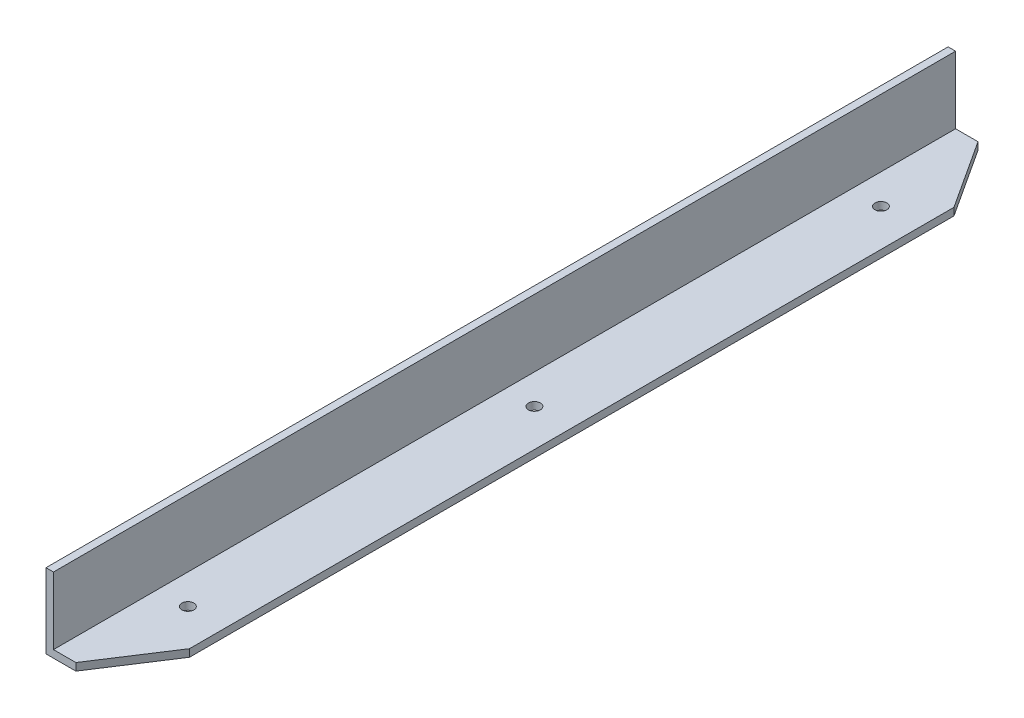
ISO-10303-21;
HEADER;
FILE_DESCRIPTION(('STEP AP214'),'2;1');
FILE_NAME('part.step','',(''),(''),'','','');
FILE_SCHEMA(('AUTOMOTIVE_DESIGN { 1 0 10303 214 1 1 1 1 }'));
ENDSEC;
DATA;
#1=APPLICATION_CONTEXT('core data for automotive mechanical design processes');
#2=APPLICATION_PROTOCOL_DEFINITION('international standard','automotive_design',2000,#1);
#3=PRODUCT_CONTEXT('',#1,'mechanical');
#4=PRODUCT('Part','Part','',(#3));
#5=PRODUCT_RELATED_PRODUCT_CATEGORY('part','',(#4));
#6=PRODUCT_DEFINITION_FORMATION('','',#4);
#7=PRODUCT_DEFINITION_CONTEXT('part definition',#1,'design');
#8=PRODUCT_DEFINITION('design','',#6,#7);
#9=PRODUCT_DEFINITION_SHAPE('','',#8);
#10=(LENGTH_UNIT() NAMED_UNIT(*) SI_UNIT(.MILLI.,.METRE.));
#11=(NAMED_UNIT(*) PLANE_ANGLE_UNIT() SI_UNIT($,.RADIAN.));
#12=(NAMED_UNIT(*) SI_UNIT($,.STERADIAN.) SOLID_ANGLE_UNIT());
#13=UNCERTAINTY_MEASURE_WITH_UNIT(LENGTH_MEASURE(1.E-05),#10,'distance_accuracy_value','');
#14=(GEOMETRIC_REPRESENTATION_CONTEXT(3) GLOBAL_UNCERTAINTY_ASSIGNED_CONTEXT((#13)) GLOBAL_UNIT_ASSIGNED_CONTEXT((#10,
#11,#12)) REPRESENTATION_CONTEXT('',''));
#15=CARTESIAN_POINT('',(0.,0.,0.));
#16=DIRECTION('',(0.,0.,1.));
#17=DIRECTION('',(1.,0.,0.));
#18=AXIS2_PLACEMENT_3D('',#15,#16,#17);
#19=CARTESIAN_POINT('',(8.27485380116921,-30.4619883040935,232.01));
#20=DIRECTION('',(0.,1.,0.));
#21=DIRECTION('',(0.,0.,1.));
#22=AXIS2_PLACEMENT_3D('',#19,#20,#21);
#23=CYLINDRICAL_SURFACE('',#22,4.);
#24=CARTESIAN_POINT('',(8.27485380116944,-10.4619883040936,232.01));
#25=DIRECTION('',(0.,1.,0.));
#26=DIRECTION('',(0.,0.,1.));
#27=AXIS2_PLACEMENT_3D('',#24,#25,#26);
#28=CIRCLE('',#27,4.);
#29=CARTESIAN_POINT('',(8.27485380116944,-10.4619883040936,236.01));
#30=VERTEX_POINT('',#29);
#31=EDGE_CURVE('E48',#30,#30,#28,.T.);
#32=ORIENTED_EDGE('',*,*,#31,.T.);
#33=EDGE_LOOP('',(#32));
#34=FACE_BOUND('',#33,.T.);
#35=CARTESIAN_POINT('',(8.27485380116921,-15.4619883040936,232.01));
#36=DIRECTION('',(0.,1.,0.));
#37=DIRECTION('',(-0.999999999999998,0.,0.));
#38=AXIS2_PLACEMENT_3D('',#35,#36,#37);
#39=CIRCLE('',#38,4.);
#40=CARTESIAN_POINT('',(4.27485380116922,-15.4619883040936,232.01));
#41=VERTEX_POINT('',#40);
#42=EDGE_CURVE('E11',#41,#41,#39,.T.);
#43=ORIENTED_EDGE('',*,*,#42,.F.);
#44=EDGE_LOOP('',(#43));
#45=FACE_BOUND('',#44,.T.);
#46=ADVANCED_FACE('F40',(#34,#45),#23,.F.);
#47=CARTESIAN_POINT('',(33.2748538011698,-15.4619883040935,302.009999999999));
#48=DIRECTION('',(0.,1.,0.));
#49=DIRECTION('',(-0.999999999999998,0.,0.));
#50=AXIS2_PLACEMENT_3D('',#47,#48,#49);
#51=PLANE('',#50);
#52=CARTESIAN_POINT('',(8.27485380116966,-15.4619883040936,1.11022302462516E-13));
#53=DIRECTION('',(0.,1.,0.));
#54=DIRECTION('',(-0.999999999999998,0.,0.));
#55=AXIS2_PLACEMENT_3D('',#52,#53,#54);
#56=CIRCLE('',#55,4.);
#57=CARTESIAN_POINT('',(4.27485380116966,-15.4619883040936,1.11022302462516E-13));
#58=VERTEX_POINT('',#57);
#59=EDGE_CURVE('E123',#58,#58,#56,.T.);
#60=ORIENTED_EDGE('',*,*,#59,.T.);
#61=EDGE_LOOP('',(#60));
#62=FACE_BOUND('',#61,.T.);
#63=CARTESIAN_POINT('',(8.27485380116944,-15.4619883040938,-232.009999999999));
#64=DIRECTION('',(0.,1.,0.));
#65=DIRECTION('',(-0.999999999999998,0.,0.));
#66=AXIS2_PLACEMENT_3D('',#63,#64,#65);
#67=CIRCLE('',#66,4.);
#68=CARTESIAN_POINT('',(4.27485380116944,-15.4619883040938,-232.009999999999));
#69=VERTEX_POINT('',#68);
#70=EDGE_CURVE('E202',#69,#69,#67,.T.);
#71=ORIENTED_EDGE('',*,*,#70,.T.);
#72=EDGE_LOOP('',(#71));
#73=FACE_BOUND('',#72,.T.);
#74=DIRECTION('',(0.545454545454544,0.,-0.838140405208444));
#75=VECTOR('',#74,1.);
#76=CARTESIAN_POINT('',(12.2004736358805,-15.4619883040936,288.294975187498));
#77=LINE('',#76,#75);
#78=CARTESIAN_POINT('',(3.27485380116976,-15.4619883040936,302.01));
#79=VERTEX_POINT('',#78);
#80=CARTESIAN_POINT('',(33.2748538011696,-15.4619883040936,255.912277713535));
#81=VERTEX_POINT('',#80);
#82=EDGE_CURVE('E107',#79,#81,#77,.T.);
#83=ORIENTED_EDGE('',*,*,#82,.F.);
#84=DIRECTION('',(0.999999999999998,0.,0.));
#85=VECTOR('',#84,1.);
#86=CARTESIAN_POINT('',(33.2748538011698,-15.4619883040935,302.009999999999));
#87=LINE('',#86,#85);
#88=CARTESIAN_POINT('',(-16.7251461988303,-15.4619883040936,302.01));
#89=VERTEX_POINT('',#88);
#90=EDGE_CURVE('E255',#89,#79,#87,.T.);
#91=ORIENTED_EDGE('',*,*,#90,.F.);
#92=DIRECTION('',(0.,0.,-1.));
#93=VECTOR('',#92,1.);
#94=CARTESIAN_POINT('',(-16.7251461988303,-15.4619883040936,302.01));
#95=LINE('',#94,#93);
#96=CARTESIAN_POINT('',(-16.7251461988307,-15.4619883040936,-302.009999999999));
#97=VERTEX_POINT('',#96);
#98=EDGE_CURVE('E135',#89,#97,#95,.T.);
#99=ORIENTED_EDGE('',*,*,#98,.T.);
#100=DIRECTION('',(0.999999999999998,0.,0.));
#101=VECTOR('',#100,1.);
#102=CARTESIAN_POINT('',(33.2748538011693,-15.4619883040936,-302.009999999999));
#103=LINE('',#102,#101);
#104=CARTESIAN_POINT('',(3.27485380116932,-15.4619883040936,-302.009999999999));
#105=VERTEX_POINT('',#104);
#106=EDGE_CURVE('E201',#97,#105,#103,.T.);
#107=ORIENTED_EDGE('',*,*,#106,.T.);
#108=DIRECTION('',(0.545454545454544,0.,0.838140405208444));
#109=VECTOR('',#108,1.);
#110=CARTESIAN_POINT('',(288.33878321079,-15.4619883040933,136.016595060436));
#111=LINE('',#110,#109);
#112=CARTESIAN_POINT('',(33.2748538011693,-15.4619883040938,-255.912277713535));
#113=VERTEX_POINT('',#112);
#114=EDGE_CURVE('E63',#105,#113,#111,.T.);
#115=ORIENTED_EDGE('',*,*,#114,.T.);
#116=DIRECTION('',(0.,0.,-1.));
#117=VECTOR('',#116,1.);
#118=CARTESIAN_POINT('',(33.2748538011698,-15.4619883040935,302.009999999999));
#119=LINE('',#118,#117);
#120=EDGE_CURVE('E129',#81,#113,#119,.T.);
#121=ORIENTED_EDGE('',*,*,#120,.F.);
#122=EDGE_LOOP('',(#83,#91,#99,#107,#115,#121));
#123=FACE_BOUND('',#122,.T.);
#124=ORIENTED_EDGE('',*,*,#42,.T.);
#125=EDGE_LOOP('',(#124));
#126=FACE_BOUND('',#125,.T.);
#127=ADVANCED_FACE('F167',(#62,#73,#123,#126),#51,.F.);
#128=CARTESIAN_POINT('',(33.2748538011698,-10.4619883040936,302.01));
#129=DIRECTION('',(-0.999999999999998,0.,0.));
#130=DIRECTION('',(0.,0.,1.));
#131=AXIS2_PLACEMENT_3D('',#128,#129,#130);
#132=PLANE('',#131);
#133=DIRECTION('',(0.,1.,0.));
#134=VECTOR('',#133,1.);
#135=CARTESIAN_POINT('',(33.2748538011696,-18.4619883040936,255.912277713535));
#136=LINE('',#135,#134);
#137=CARTESIAN_POINT('',(33.2748538011689,-10.4619883040936,255.912277713536));
#138=VERTEX_POINT('',#137);
#139=EDGE_CURVE('E104',#81,#138,#136,.T.);
#140=ORIENTED_EDGE('',*,*,#139,.F.);
#141=ORIENTED_EDGE('',*,*,#120,.T.);
#142=DIRECTION('',(0.,1.,0.));
#143=VECTOR('',#142,1.);
#144=CARTESIAN_POINT('',(33.2748538011693,-18.4619883040938,-255.912277713535));
#145=LINE('',#144,#143);
#146=CARTESIAN_POINT('',(33.2748538011693,-10.4619883040938,-255.912277713535));
#147=VERTEX_POINT('',#146);
#148=EDGE_CURVE('E127',#113,#147,#145,.T.);
#149=ORIENTED_EDGE('',*,*,#148,.T.);
#150=DIRECTION('',(0.,0.,-1.));
#151=VECTOR('',#150,1.);
#152=CARTESIAN_POINT('',(33.2748538011698,-10.4619883040936,302.01));
#153=LINE('',#152,#151);
#154=EDGE_CURVE('E118',#138,#147,#153,.T.);
#155=ORIENTED_EDGE('',*,*,#154,.F.);
#156=EDGE_LOOP('',(#140,#141,#149,#155));
#157=FACE_BOUND('',#156,.T.);
#158=ADVANCED_FACE('F126',(#157),#132,.F.);
#159=CARTESIAN_POINT('',(-11.7251461988301,-10.4619883040936,302.01));
#160=DIRECTION('',(0.,-1.,0.));
#161=DIRECTION('',(0.,0.,-1.));
#162=AXIS2_PLACEMENT_3D('',#159,#160,#161);
#163=PLANE('',#162);
#164=CARTESIAN_POINT('',(8.27485380116966,-10.4619883040936,1.11022302462516E-13));
#165=DIRECTION('',(0.,1.,0.));
#166=DIRECTION('',(0.,0.,1.));
#167=AXIS2_PLACEMENT_3D('',#164,#165,#166);
#168=CIRCLE('',#167,4.);
#169=CARTESIAN_POINT('',(8.27485380116966,-10.4619883040936,4.00000000000011));
#170=VERTEX_POINT('',#169);
#171=EDGE_CURVE('E381',#170,#170,#168,.T.);
#172=ORIENTED_EDGE('',*,*,#171,.F.);
#173=EDGE_LOOP('',(#172));
#174=FACE_BOUND('',#173,.T.);
#175=CARTESIAN_POINT('',(8.27485380116944,-10.4619883040938,-232.009999999999));
#176=DIRECTION('',(0.,1.,0.));
#177=DIRECTION('',(0.,0.,1.));
#178=AXIS2_PLACEMENT_3D('',#175,#176,#177);
#179=CIRCLE('',#178,4.);
#180=CARTESIAN_POINT('',(8.27485380116944,-10.4619883040938,-228.009999999999));
#181=VERTEX_POINT('',#180);
#182=EDGE_CURVE('E211',#181,#181,#179,.T.);
#183=ORIENTED_EDGE('',*,*,#182,.F.);
#184=EDGE_LOOP('',(#183));
#185=FACE_BOUND('',#184,.T.);
#186=DIRECTION('',(0.545454545454544,0.,-0.838140405208444));
#187=VECTOR('',#186,1.);
#188=CARTESIAN_POINT('',(33.2748538011689,-10.4619883040936,255.912277713536));
#189=LINE('',#188,#187);
#190=CARTESIAN_POINT('',(3.27485380116976,-10.4619883040936,302.01));
#191=VERTEX_POINT('',#190);
#192=EDGE_CURVE('E55',#191,#138,#189,.T.);
#193=ORIENTED_EDGE('',*,*,#192,.T.);
#194=ORIENTED_EDGE('',*,*,#154,.T.);
#195=DIRECTION('',(0.545454545454544,0.,0.838140405208444));
#196=VECTOR('',#195,1.);
#197=CARTESIAN_POINT('',(33.2748538011693,-10.4619883040938,-255.912277713535));
#198=LINE('',#197,#196);
#199=CARTESIAN_POINT('',(3.27485380116932,-10.4619883040936,-302.009999999999));
#200=VERTEX_POINT('',#199);
#201=EDGE_CURVE('E238',#200,#147,#198,.T.);
#202=ORIENTED_EDGE('',*,*,#201,.F.);
#203=DIRECTION('',(-0.999999999999998,0.,0.));
#204=VECTOR('',#203,1.);
#205=CARTESIAN_POINT('',(-11.7251461988306,-10.4619883040936,-302.01));
#206=LINE('',#205,#204);
#207=CARTESIAN_POINT('',(-11.7251461988306,-10.4619883040936,-302.01));
#208=VERTEX_POINT('',#207);
#209=EDGE_CURVE('E208',#200,#208,#206,.T.);
#210=ORIENTED_EDGE('',*,*,#209,.T.);
#211=DIRECTION('',(0.,0.,-1.));
#212=VECTOR('',#211,1.);
#213=CARTESIAN_POINT('',(-11.7251461988301,-10.4619883040936,302.01));
#214=LINE('',#213,#212);
#215=CARTESIAN_POINT('',(-11.7251461988301,-10.4619883040936,302.01));
#216=VERTEX_POINT('',#215);
#217=EDGE_CURVE('E130',#216,#208,#214,.T.);
#218=ORIENTED_EDGE('',*,*,#217,.F.);
#219=DIRECTION('',(-0.999999999999998,0.,0.));
#220=VECTOR('',#219,1.);
#221=CARTESIAN_POINT('',(-11.7251461988301,-10.4619883040936,302.01));
#222=LINE('',#221,#220);
#223=EDGE_CURVE('E121',#191,#216,#222,.T.);
#224=ORIENTED_EDGE('',*,*,#223,.F.);
#225=EDGE_LOOP('',(#193,#194,#202,#210,#218,#224));
#226=FACE_BOUND('',#225,.T.);
#227=ORIENTED_EDGE('',*,*,#31,.F.);
#228=EDGE_LOOP('',(#227));
#229=FACE_BOUND('',#228,.T.);
#230=ADVANCED_FACE('F115',(#174,#185,#226,#229),#163,.F.);
#231=CARTESIAN_POINT('',(6.66133814775094E-13,0.,302.01));
#232=DIRECTION('',(0.,0.,-1.));
#233=DIRECTION('',(-0.999999999999998,0.,0.));
#234=AXIS2_PLACEMENT_3D('',#231,#232,#233);
#235=PLANE('',#234);
#236=DIRECTION('',(0.,-1.,0.));
#237=VECTOR('',#236,1.);
#238=CARTESIAN_POINT('',(3.27485380117021,0.,302.01));
#239=LINE('',#238,#237);
#240=EDGE_CURVE('E148',#191,#79,#239,.T.);
#241=ORIENTED_EDGE('',*,*,#240,.F.);
#242=ORIENTED_EDGE('',*,*,#223,.T.);
#243=DIRECTION('',(0.,1.,0.));
#244=VECTOR('',#243,1.);
#245=CARTESIAN_POINT('',(-11.7251461988295,34.5380116959064,302.01));
#246=LINE('',#245,#244);
#247=CARTESIAN_POINT('',(-11.7251461988295,34.5380116959064,302.01));
#248=VERTEX_POINT('',#247);
#249=EDGE_CURVE('E237',#216,#248,#246,.T.);
#250=ORIENTED_EDGE('',*,*,#249,.T.);
#251=DIRECTION('',(-0.999999999999998,0.,0.));
#252=VECTOR('',#251,1.);
#253=CARTESIAN_POINT('',(-16.7251461988296,34.5380116959064,302.01));
#254=LINE('',#253,#252);
#255=CARTESIAN_POINT('',(-16.7251461988296,34.5380116959064,302.01));
#256=VERTEX_POINT('',#255);
#257=EDGE_CURVE('E214',#248,#256,#254,.T.);
#258=ORIENTED_EDGE('',*,*,#257,.T.);
#259=DIRECTION('',(0.,-1.,0.));
#260=VECTOR('',#259,1.);
#261=CARTESIAN_POINT('',(-16.7251461988303,-15.4619883040936,302.01));
#262=LINE('',#261,#260);
#263=EDGE_CURVE('E225',#256,#89,#262,.T.);
#264=ORIENTED_EDGE('',*,*,#263,.T.);
#265=ORIENTED_EDGE('',*,*,#90,.T.);
#266=EDGE_LOOP('',(#241,#242,#250,#258,#264,#265));
#267=FACE_BOUND('',#266,.T.);
#268=ADVANCED_FACE('F157',(#267),#235,.F.);
#269=CARTESIAN_POINT('',(-16.7251461988303,-15.4619883040936,302.01));
#270=DIRECTION('',(0.999999999999998,0.,0.));
#271=DIRECTION('',(0.,0.,-1.));
#272=AXIS2_PLACEMENT_3D('',#269,#270,#271);
#273=PLANE('',#272);
#274=DIRECTION('',(0.,-1.,0.));
#275=VECTOR('',#274,1.);
#276=CARTESIAN_POINT('',(-16.7251461988307,-15.4619883040936,-302.009999999999));
#277=LINE('',#276,#275);
#278=CARTESIAN_POINT('',(-16.7251461988303,34.5380116959064,-302.01));
#279=VERTEX_POINT('',#278);
#280=EDGE_CURVE('E194',#279,#97,#277,.T.);
#281=ORIENTED_EDGE('',*,*,#280,.T.);
#282=ORIENTED_EDGE('',*,*,#98,.F.);
#283=ORIENTED_EDGE('',*,*,#263,.F.);
#284=DIRECTION('',(0.,0.,-1.));
#285=VECTOR('',#284,1.);
#286=CARTESIAN_POINT('',(-16.7251461988296,34.5380116959064,302.01));
#287=LINE('',#286,#285);
#288=EDGE_CURVE('E197',#256,#279,#287,.T.);
#289=ORIENTED_EDGE('',*,*,#288,.T.);
#290=EDGE_LOOP('',(#281,#282,#283,#289));
#291=FACE_BOUND('',#290,.T.);
#292=ADVANCED_FACE('F164',(#291),#273,.F.);
#293=CARTESIAN_POINT('',(-11.7251461988295,34.5380116959064,302.01));
#294=DIRECTION('',(-0.999999999999998,0.,0.));
#295=DIRECTION('',(0.,-1.,0.));
#296=AXIS2_PLACEMENT_3D('',#293,#294,#295);
#297=PLANE('',#296);
#298=DIRECTION('',(0.,1.,0.));
#299=VECTOR('',#298,1.);
#300=CARTESIAN_POINT('',(-11.7251461988304,34.5380116959064,-302.01));
#301=LINE('',#300,#299);
#302=CARTESIAN_POINT('',(-11.7251461988304,34.5380116959064,-302.01));
#303=VERTEX_POINT('',#302);
#304=EDGE_CURVE('E219',#208,#303,#301,.T.);
#305=ORIENTED_EDGE('',*,*,#304,.T.);
#306=DIRECTION('',(0.,0.,-1.));
#307=VECTOR('',#306,1.);
#308=CARTESIAN_POINT('',(-11.7251461988295,34.5380116959064,302.01));
#309=LINE('',#308,#307);
#310=EDGE_CURVE('E138',#248,#303,#309,.T.);
#311=ORIENTED_EDGE('',*,*,#310,.F.);
#312=ORIENTED_EDGE('',*,*,#249,.F.);
#313=ORIENTED_EDGE('',*,*,#217,.T.);
#314=EDGE_LOOP('',(#305,#311,#312,#313));
#315=FACE_BOUND('',#314,.T.);
#316=ADVANCED_FACE('F183',(#315),#297,.F.);
#317=CARTESIAN_POINT('',(-16.7251461988296,34.5380116959064,302.01));
#318=DIRECTION('',(0.,-1.,0.));
#319=DIRECTION('',(0.,0.,-1.));
#320=AXIS2_PLACEMENT_3D('',#317,#318,#319);
#321=PLANE('',#320);
#322=DIRECTION('',(-0.999999999999998,0.,0.));
#323=VECTOR('',#322,1.);
#324=CARTESIAN_POINT('',(-16.7251461988303,34.5380116959064,-302.01));
#325=LINE('',#324,#323);
#326=EDGE_CURVE('E222',#303,#279,#325,.T.);
#327=ORIENTED_EDGE('',*,*,#326,.T.);
#328=ORIENTED_EDGE('',*,*,#288,.F.);
#329=ORIENTED_EDGE('',*,*,#257,.F.);
#330=ORIENTED_EDGE('',*,*,#310,.T.);
#331=EDGE_LOOP('',(#327,#328,#329,#330));
#332=FACE_BOUND('',#331,.T.);
#333=ADVANCED_FACE('F188',(#332),#321,.F.);
#334=CARTESIAN_POINT('',(-2.22044604925031E-13,0.,-302.01));
#335=DIRECTION('',(0.,0.,-1.));
#336=DIRECTION('',(-0.999999999999998,0.,0.));
#337=AXIS2_PLACEMENT_3D('',#334,#335,#336);
#338=PLANE('',#337);
#339=DIRECTION('',(0.,1.,0.));
#340=VECTOR('',#339,1.);
#341=CARTESIAN_POINT('',(3.27485380116932,0.,-302.01));
#342=LINE('',#341,#340);
#343=EDGE_CURVE('E145',#105,#200,#342,.T.);
#344=ORIENTED_EDGE('',*,*,#343,.F.);
#345=ORIENTED_EDGE('',*,*,#106,.F.);
#346=ORIENTED_EDGE('',*,*,#280,.F.);
#347=ORIENTED_EDGE('',*,*,#326,.F.);
#348=ORIENTED_EDGE('',*,*,#304,.F.);
#349=ORIENTED_EDGE('',*,*,#209,.F.);
#350=EDGE_LOOP('',(#344,#345,#346,#347,#348,#349));
#351=FACE_BOUND('',#350,.T.);
#352=ADVANCED_FACE('F235',(#351),#338,.T.);
#353=CARTESIAN_POINT('',(8.27485380116966,-30.4619883040939,-232.01));
#354=DIRECTION('',(0.,1.,0.));
#355=DIRECTION('',(0.,0.,1.));
#356=AXIS2_PLACEMENT_3D('',#353,#354,#355);
#357=CYLINDRICAL_SURFACE('',#356,4.);
#358=ORIENTED_EDGE('',*,*,#182,.T.);
#359=EDGE_LOOP('',(#358));
#360=FACE_BOUND('',#359,.T.);
#361=ORIENTED_EDGE('',*,*,#70,.F.);
#362=EDGE_LOOP('',(#361));
#363=FACE_BOUND('',#362,.T.);
#364=ADVANCED_FACE('F268',(#360,#363),#357,.F.);
#365=CARTESIAN_POINT('',(33.2748538011693,-18.4619883040938,-255.912277713535));
#366=DIRECTION('',(-0.838140405208442,0.,0.545454545454546));
#367=DIRECTION('',(0.545454545454544,0.,0.838140405208444));
#368=AXIS2_PLACEMENT_3D('',#365,#366,#367);
#369=PLANE('',#368);
#370=ORIENTED_EDGE('',*,*,#343,.T.);
#371=ORIENTED_EDGE('',*,*,#201,.T.);
#372=ORIENTED_EDGE('',*,*,#148,.F.);
#373=ORIENTED_EDGE('',*,*,#114,.F.);
#374=EDGE_LOOP('',(#370,#371,#372,#373));
#375=FACE_BOUND('',#374,.T.);
#376=ADVANCED_FACE('F266',(#375),#369,.F.);
#377=CARTESIAN_POINT('',(33.2748538011696,-18.4619883040936,255.912277713535));
#378=DIRECTION('',(0.838140405208442,0.,0.545454545454546));
#379=DIRECTION('',(0.545454545454544,0.,-0.838140405208444));
#380=AXIS2_PLACEMENT_3D('',#377,#378,#379);
#381=PLANE('',#380);
#382=ORIENTED_EDGE('',*,*,#82,.T.);
#383=ORIENTED_EDGE('',*,*,#139,.T.);
#384=ORIENTED_EDGE('',*,*,#192,.F.);
#385=ORIENTED_EDGE('',*,*,#240,.T.);
#386=EDGE_LOOP('',(#382,#383,#384,#385));
#387=FACE_BOUND('',#386,.T.);
#388=ADVANCED_FACE('F105',(#387),#381,.T.);
#389=CARTESIAN_POINT('',(8.27485380116966,-30.4619883040935,1.11022302462516E-13));
#390=DIRECTION('',(0.,1.,0.));
#391=DIRECTION('',(0.,0.,1.));
#392=AXIS2_PLACEMENT_3D('',#389,#390,#391);
#393=CYLINDRICAL_SURFACE('',#392,4.);
#394=ORIENTED_EDGE('',*,*,#171,.T.);
#395=EDGE_LOOP('',(#394));
#396=FACE_BOUND('',#395,.T.);
#397=ORIENTED_EDGE('',*,*,#59,.F.);
#398=EDGE_LOOP('',(#397));
#399=FACE_BOUND('',#398,.T.);
#400=ADVANCED_FACE('F274',(#396,#399),#393,.F.);
#401=CLOSED_SHELL('',(#46,#127,#158,#230,#268,#292,#316,#333,#352,#364,#376,#388,#400));
#402=MANIFOLD_SOLID_BREP('B2',#401);
#403=ADVANCED_BREP_SHAPE_REPRESENTATION('',(#18,#402),#14);
#404=SHAPE_DEFINITION_REPRESENTATION(#9,#403);
ENDSEC;
END-ISO-10303-21;
